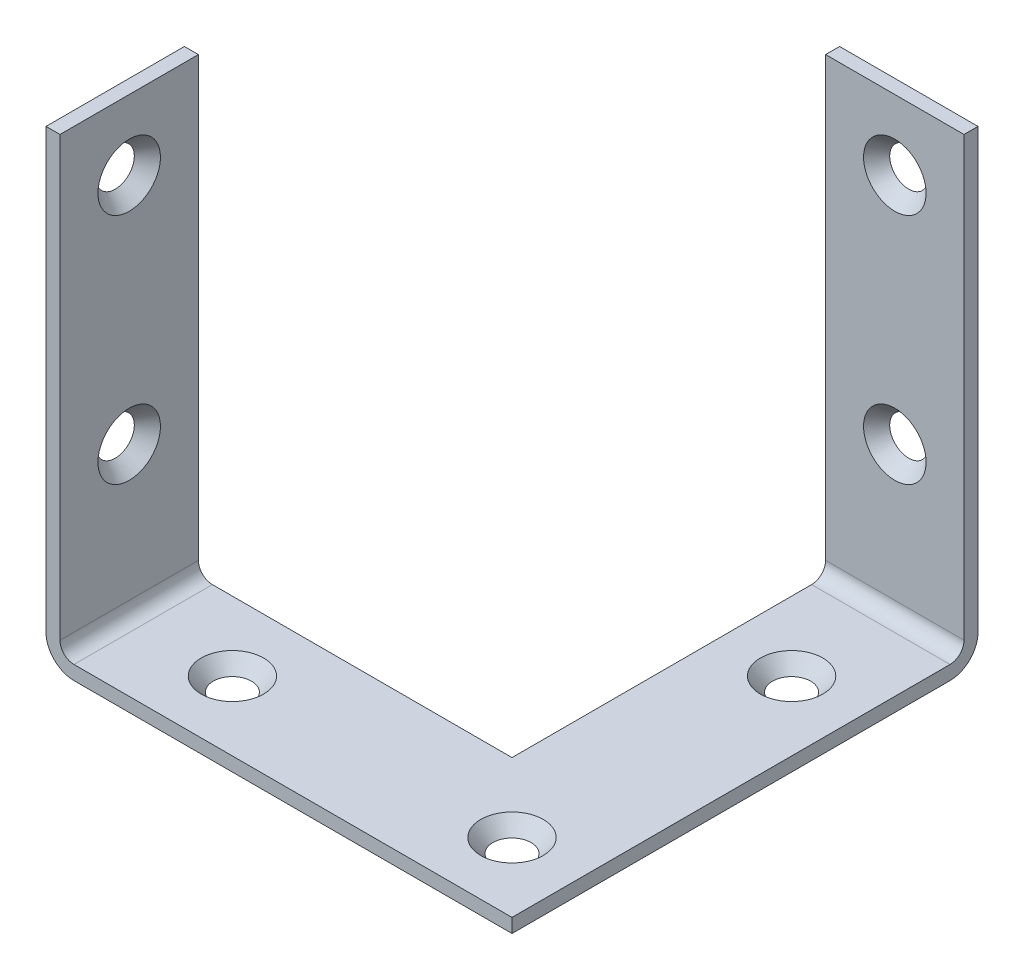
ISO-10303-21;
HEADER;
FILE_DESCRIPTION(('STEP AP214'),'2;1');
FILE_NAME('part.step','',(''),(''),'','','');
FILE_SCHEMA(('AUTOMOTIVE_DESIGN { 1 0 10303 214 1 1 1 1 }'));
ENDSEC;
DATA;
#1=APPLICATION_CONTEXT('core data for automotive mechanical design processes');
#2=APPLICATION_PROTOCOL_DEFINITION('international standard','automotive_design',2000,#1);
#3=PRODUCT_CONTEXT('',#1,'mechanical');
#4=PRODUCT('Part','Part','',(#3));
#5=PRODUCT_RELATED_PRODUCT_CATEGORY('part','',(#4));
#6=PRODUCT_DEFINITION_FORMATION('','',#4);
#7=PRODUCT_DEFINITION_CONTEXT('part definition',#1,'design');
#8=PRODUCT_DEFINITION('design','',#6,#7);
#9=PRODUCT_DEFINITION_SHAPE('','',#8);
#10=(LENGTH_UNIT() NAMED_UNIT(*) SI_UNIT(.MILLI.,.METRE.));
#11=(NAMED_UNIT(*) PLANE_ANGLE_UNIT() SI_UNIT($,.RADIAN.));
#12=(NAMED_UNIT(*) SI_UNIT($,.STERADIAN.) SOLID_ANGLE_UNIT());
#13=UNCERTAINTY_MEASURE_WITH_UNIT(LENGTH_MEASURE(1.E-05),#10,'distance_accuracy_value','');
#14=(GEOMETRIC_REPRESENTATION_CONTEXT(3) GLOBAL_UNCERTAINTY_ASSIGNED_CONTEXT((#13)) GLOBAL_UNIT_ASSIGNED_CONTEXT((#10,
#11,#12)) REPRESENTATION_CONTEXT('',''));
#15=CARTESIAN_POINT('',(0.,0.,0.));
#16=DIRECTION('',(0.,0.,1.));
#17=DIRECTION('',(1.,0.,0.));
#18=AXIS2_PLACEMENT_3D('',#15,#16,#17);
#19=CARTESIAN_POINT('',(-15.0875999999999,3.048,-40.2082));
#20=DIRECTION('',(-1.,0.,0.));
#21=DIRECTION('',(0.,0.,1.));
#22=AXIS2_PLACEMENT_3D('',#19,#20,#21);
#23=PLANE('',#22);
#24=DIRECTION('',(0.,0.,1.));
#25=VECTOR('',#24,1.);
#26=CARTESIAN_POINT('',(-15.0875999999999,0.,-40.2082));
#27=LINE('',#26,#25);
#28=CARTESIAN_POINT('',(-15.0875999999999,0.,-40.2082));
#29=VERTEX_POINT('',#28);
#30=CARTESIAN_POINT('',(-15.0876,0.,-7.5438));
#31=VERTEX_POINT('',#30);
#32=EDGE_CURVE('E130',#29,#31,#27,.T.);
#33=ORIENTED_EDGE('',*,*,#32,.T.);
#34=DIRECTION('',(0.,1.,0.));
#35=VECTOR('',#34,1.);
#36=CARTESIAN_POINT('',(-15.0876,3.048,-7.54380000000001));
#37=LINE('',#36,#35);
#38=CARTESIAN_POINT('',(-15.0876,1.524,-7.5438));
#39=VERTEX_POINT('',#38);
#40=EDGE_CURVE('E11',#31,#39,#37,.T.);
#41=ORIENTED_EDGE('',*,*,#40,.T.);
#42=DIRECTION('',(0.,0.,1.));
#43=VECTOR('',#42,1.);
#44=CARTESIAN_POINT('',(-15.0875999999999,1.524,-40.2082));
#45=LINE('',#44,#43);
#46=CARTESIAN_POINT('',(-15.0875999999999,1.524,-40.2082));
#47=VERTEX_POINT('',#46);
#48=EDGE_CURVE('E133',#47,#39,#45,.T.);
#49=ORIENTED_EDGE('',*,*,#48,.F.);
#50=CARTESIAN_POINT('',(-15.0875999999999,3.048,-40.2082));
#51=DIRECTION('',(-1.,0.,0.));
#52=DIRECTION('',(0.,0.,1.));
#53=AXIS2_PLACEMENT_3D('',#50,#51,#52);
#54=CIRCLE('',#53,1.524);
#55=CARTESIAN_POINT('',(-15.0875999999999,3.048,-41.7322));
#56=VERTEX_POINT('',#55);
#57=EDGE_CURVE('E137',#56,#47,#54,.T.);
#58=ORIENTED_EDGE('',*,*,#57,.F.);
#59=DIRECTION('',(0.,-1.,0.));
#60=VECTOR('',#59,1.);
#61=CARTESIAN_POINT('',(-15.0875999999999,50.8,-41.7322));
#62=LINE('',#61,#60);
#63=CARTESIAN_POINT('',(-15.0875999999999,50.8,-41.7322));
#64=VERTEX_POINT('',#63);
#65=EDGE_CURVE('E139',#64,#56,#62,.T.);
#66=ORIENTED_EDGE('',*,*,#65,.F.);
#67=DIRECTION('',(0.,0.,1.));
#68=VECTOR('',#67,1.);
#69=CARTESIAN_POINT('',(-15.0875999999999,50.8,-43.2562));
#70=LINE('',#69,#68);
#71=CARTESIAN_POINT('',(-15.0875999999999,50.8,-43.2562));
#72=VERTEX_POINT('',#71);
#73=EDGE_CURVE('E141',#72,#64,#70,.T.);
#74=ORIENTED_EDGE('',*,*,#73,.F.);
#75=DIRECTION('',(0.,-1.,0.));
#76=VECTOR('',#75,1.);
#77=CARTESIAN_POINT('',(-15.0875999999999,50.8,-43.2562));
#78=LINE('',#77,#76);
#79=CARTESIAN_POINT('',(-15.0875999999999,3.048,-43.2562));
#80=VERTEX_POINT('',#79);
#81=EDGE_CURVE('E110',#72,#80,#78,.T.);
#82=ORIENTED_EDGE('',*,*,#81,.T.);
#83=CARTESIAN_POINT('',(-15.0875999999999,3.048,-40.2082));
#84=DIRECTION('',(-1.,0.,0.));
#85=DIRECTION('',(0.,0.,-1.));
#86=AXIS2_PLACEMENT_3D('',#83,#84,#85);
#87=CIRCLE('',#86,3.048);
#88=EDGE_CURVE('E144',#80,#29,#87,.T.);
#89=ORIENTED_EDGE('',*,*,#88,.T.);
#90=EDGE_LOOP('',(#33,#41,#49,#58,#66,#74,#82,#89));
#91=FACE_BOUND('',#90,.T.);
#92=ADVANCED_FACE('F38',(#91),#23,.T.);
#93=CARTESIAN_POINT('',(1.26634813746307E-13,0.,-40.2082));
#94=DIRECTION('',(0.,-1.,0.));
#95=DIRECTION('',(1.,0.,0.));
#96=AXIS2_PLACEMENT_3D('',#93,#94,#95);
#97=PLANE('',#96);
#98=DIRECTION('',(1.,0.,0.));
#99=VECTOR('',#98,1.);
#100=CARTESIAN_POINT('',(-47.752,0.,-7.5438));
#101=LINE('',#100,#99);
#102=CARTESIAN_POINT('',(-47.752,0.,-7.5438));
#103=VERTEX_POINT('',#102);
#104=EDGE_CURVE('E508',#103,#31,#101,.T.);
#105=ORIENTED_EDGE('',*,*,#104,.T.);
#106=ORIENTED_EDGE('',*,*,#32,.F.);
#107=DIRECTION('',(-1.,0.,0.));
#108=VECTOR('',#107,1.);
#109=CARTESIAN_POINT('',(1.26634813746307E-13,0.,-40.2082));
#110=LINE('',#109,#108);
#111=CARTESIAN_POINT('',(1.26634813746307E-13,0.,-40.2082));
#112=VERTEX_POINT('',#111);
#113=EDGE_CURVE('E55',#112,#29,#110,.T.);
#114=ORIENTED_EDGE('',*,*,#113,.F.);
#115=DIRECTION('',(0.,0.,1.));
#116=VECTOR('',#115,1.);
#117=CARTESIAN_POINT('',(1.26634813746307E-13,0.,-40.2082));
#118=LINE('',#117,#116);
#119=CARTESIAN_POINT('',(0.,0.,7.54380000000004));
#120=VERTEX_POINT('',#119);
#121=EDGE_CURVE('E88',#112,#120,#118,.T.);
#122=ORIENTED_EDGE('',*,*,#121,.T.);
#123=DIRECTION('',(-1.,0.,0.));
#124=VECTOR('',#123,1.);
#125=CARTESIAN_POINT('',(0.,0.,7.54380000000004));
#126=LINE('',#125,#124);
#127=CARTESIAN_POINT('',(-47.752,0.,7.5438));
#128=VERTEX_POINT('',#127);
#129=EDGE_CURVE('E126',#120,#128,#126,.T.);
#130=ORIENTED_EDGE('',*,*,#129,.T.);
#131=DIRECTION('',(0.,0.,1.));
#132=VECTOR('',#131,1.);
#133=CARTESIAN_POINT('',(-47.752,0.,-7.5438));
#134=LINE('',#133,#132);
#135=EDGE_CURVE('E226',#103,#128,#134,.T.);
#136=ORIENTED_EDGE('',*,*,#135,.F.);
#137=EDGE_LOOP('',(#105,#106,#114,#122,#130,#136));
#138=FACE_BOUND('',#137,.T.);
#139=CARTESIAN_POINT('',(-7.54380000000001,0.,0.));
#140=DIRECTION('',(0.,1.,0.));
#141=DIRECTION('',(-1.,0.,0.));
#142=AXIS2_PLACEMENT_3D('',#139,#140,#141);
#143=CIRCLE('',#142,2.0828);
#144=CARTESIAN_POINT('',(-9.62660000000001,0.,0.));
#145=VERTEX_POINT('',#144);
#146=EDGE_CURVE('E134',#145,#145,#143,.T.);
#147=ORIENTED_EDGE('',*,*,#146,.T.);
#148=EDGE_LOOP('',(#147));
#149=FACE_BOUND('',#148,.T.);
#150=CARTESIAN_POINT('',(-38.0238,0.,0.));
#151=DIRECTION('',(0.,1.,0.));
#152=DIRECTION('',(0.,0.,1.));
#153=AXIS2_PLACEMENT_3D('',#150,#151,#152);
#154=CIRCLE('',#153,2.0828);
#155=CARTESIAN_POINT('',(-38.0238,0.,2.0828));
#156=VERTEX_POINT('',#155);
#157=EDGE_CURVE('E495',#156,#156,#154,.T.);
#158=ORIENTED_EDGE('',*,*,#157,.T.);
#159=EDGE_LOOP('',(#158));
#160=FACE_BOUND('',#159,.T.);
#161=CARTESIAN_POINT('',(-7.54379999999991,0.,-30.48));
#162=DIRECTION('',(0.,1.,0.));
#163=DIRECTION('',(-1.,0.,0.));
#164=AXIS2_PLACEMENT_3D('',#161,#162,#163);
#165=CIRCLE('',#164,2.0828);
#166=CARTESIAN_POINT('',(-9.62659999999991,0.,-30.48));
#167=VERTEX_POINT('',#166);
#168=EDGE_CURVE('E179',#167,#167,#165,.T.);
#169=ORIENTED_EDGE('',*,*,#168,.T.);
#170=EDGE_LOOP('',(#169));
#171=FACE_BOUND('',#170,.T.);
#172=ADVANCED_FACE('F223',(#138,#149,#160,#171),#97,.T.);
#173=CARTESIAN_POINT('',(1.26634813746307E-13,3.048,-40.2082));
#174=DIRECTION('',(-1.,0.,0.));
#175=DIRECTION('',(0.,0.,1.));
#176=AXIS2_PLACEMENT_3D('',#173,#174,#175);
#177=CYLINDRICAL_SURFACE('',#176,3.048);
#178=ORIENTED_EDGE('',*,*,#88,.F.);
#179=DIRECTION('',(-1.,0.,0.));
#180=VECTOR('',#179,1.);
#181=CARTESIAN_POINT('',(1.37043154602168E-13,3.048,-43.2562));
#182=LINE('',#181,#180);
#183=CARTESIAN_POINT('',(1.37043154602168E-13,3.048,-43.2562));
#184=VERTEX_POINT('',#183);
#185=EDGE_CURVE('E79',#184,#80,#182,.T.);
#186=ORIENTED_EDGE('',*,*,#185,.F.);
#187=CARTESIAN_POINT('',(1.26634813746307E-13,3.048,-40.2082));
#188=DIRECTION('',(-1.,0.,0.));
#189=DIRECTION('',(0.,0.,-1.));
#190=AXIS2_PLACEMENT_3D('',#187,#188,#189);
#191=CIRCLE('',#190,3.048);
#192=EDGE_CURVE('E124',#184,#112,#191,.T.);
#193=ORIENTED_EDGE('',*,*,#192,.T.);
#194=ORIENTED_EDGE('',*,*,#113,.T.);
#195=EDGE_LOOP('',(#178,#186,#193,#194));
#196=FACE_BOUND('',#195,.T.);
#197=ADVANCED_FACE('F284',(#196),#177,.T.);
#198=CARTESIAN_POINT('',(1.37043154602168E-13,50.8,-43.2562));
#199=DIRECTION('',(0.,0.,-1.));
#200=DIRECTION('',(0.,-1.,0.));
#201=AXIS2_PLACEMENT_3D('',#198,#199,#200);
#202=PLANE('',#201);
#203=CARTESIAN_POINT('',(-7.54379999999986,17.78,-43.2562));
#204=DIRECTION('',(0.,0.,1.));
#205=DIRECTION('',(0.,1.,0.));
#206=AXIS2_PLACEMENT_3D('',#203,#204,#205);
#207=CIRCLE('',#206,2.0828);
#208=CARTESIAN_POINT('',(-7.54379999999986,19.8628,-43.2562));
#209=VERTEX_POINT('',#208);
#210=EDGE_CURVE('E186',#209,#209,#207,.T.);
#211=ORIENTED_EDGE('',*,*,#210,.T.);
#212=EDGE_LOOP('',(#211));
#213=FACE_BOUND('',#212,.T.);
#214=CARTESIAN_POINT('',(-7.54379999999986,43.18,-43.2562));
#215=DIRECTION('',(0.,0.,1.));
#216=DIRECTION('',(0.,1.,0.));
#217=AXIS2_PLACEMENT_3D('',#214,#215,#216);
#218=CIRCLE('',#217,2.0828);
#219=CARTESIAN_POINT('',(-7.54379999999986,45.2628,-43.2562));
#220=VERTEX_POINT('',#219);
#221=EDGE_CURVE('E181',#220,#220,#218,.T.);
#222=ORIENTED_EDGE('',*,*,#221,.T.);
#223=EDGE_LOOP('',(#222));
#224=FACE_BOUND('',#223,.T.);
#225=ORIENTED_EDGE('',*,*,#81,.F.);
#226=DIRECTION('',(-1.,0.,0.));
#227=VECTOR('',#226,1.);
#228=CARTESIAN_POINT('',(1.37043154602168E-13,50.8,-43.2562));
#229=LINE('',#228,#227);
#230=CARTESIAN_POINT('',(1.37043154602168E-13,50.8,-43.2562));
#231=VERTEX_POINT('',#230);
#232=EDGE_CURVE('E104',#231,#72,#229,.T.);
#233=ORIENTED_EDGE('',*,*,#232,.F.);
#234=DIRECTION('',(0.,-1.,0.));
#235=VECTOR('',#234,1.);
#236=CARTESIAN_POINT('',(1.37043154602168E-13,50.8,-43.2562));
#237=LINE('',#236,#235);
#238=EDGE_CURVE('E108',#231,#184,#237,.T.);
#239=ORIENTED_EDGE('',*,*,#238,.T.);
#240=ORIENTED_EDGE('',*,*,#185,.T.);
#241=EDGE_LOOP('',(#225,#233,#239,#240));
#242=FACE_BOUND('',#241,.T.);
#243=ADVANCED_FACE('F106',(#213,#224,#242),#202,.T.);
#244=CARTESIAN_POINT('',(1.37043154602168E-13,50.8,-43.2562));
#245=DIRECTION('',(0.,-1.,0.));
#246=DIRECTION('',(1.,0.,0.));
#247=AXIS2_PLACEMENT_3D('',#244,#245,#246);
#248=PLANE('',#247);
#249=ORIENTED_EDGE('',*,*,#73,.T.);
#250=DIRECTION('',(-1.,0.,0.));
#251=VECTOR('',#250,1.);
#252=CARTESIAN_POINT('',(1.31838984174237E-13,50.8,-41.7322));
#253=LINE('',#252,#251);
#254=CARTESIAN_POINT('',(1.31838984174237E-13,50.8,-41.7322));
#255=VERTEX_POINT('',#254);
#256=EDGE_CURVE('E113',#255,#64,#253,.T.);
#257=ORIENTED_EDGE('',*,*,#256,.F.);
#258=DIRECTION('',(0.,0.,1.));
#259=VECTOR('',#258,1.);
#260=CARTESIAN_POINT('',(1.37043154602168E-13,50.8,-43.2562));
#261=LINE('',#260,#259);
#262=EDGE_CURVE('E116',#231,#255,#261,.T.);
#263=ORIENTED_EDGE('',*,*,#262,.F.);
#264=ORIENTED_EDGE('',*,*,#232,.T.);
#265=EDGE_LOOP('',(#249,#257,#263,#264));
#266=FACE_BOUND('',#265,.T.);
#267=ADVANCED_FACE('F117',(#266),#248,.F.);
#268=CARTESIAN_POINT('',(1.31838984174237E-13,50.8,-41.7322));
#269=DIRECTION('',(0.,0.,-1.));
#270=DIRECTION('',(0.,-1.,0.));
#271=AXIS2_PLACEMENT_3D('',#268,#269,#270);
#272=PLANE('',#271);
#273=CARTESIAN_POINT('',(-7.54379999999987,43.18,-41.7322));
#274=DIRECTION('',(0.,0.,-1.));
#275=DIRECTION('',(0.,-1.,0.));
#276=AXIS2_PLACEMENT_3D('',#273,#274,#275);
#277=CIRCLE('',#276,3.40759298843195);
#278=CARTESIAN_POINT('',(-7.54379999999987,39.772407011568,-41.7322));
#279=VERTEX_POINT('',#278);
#280=EDGE_CURVE('E163',#279,#279,#277,.T.);
#281=ORIENTED_EDGE('',*,*,#280,.T.);
#282=EDGE_LOOP('',(#281));
#283=FACE_BOUND('',#282,.T.);
#284=CARTESIAN_POINT('',(-7.54379999999987,17.78,-41.7322));
#285=DIRECTION('',(0.,0.,-1.));
#286=DIRECTION('',(0.,-1.,0.));
#287=AXIS2_PLACEMENT_3D('',#284,#285,#286);
#288=CIRCLE('',#287,3.40759298843193);
#289=CARTESIAN_POINT('',(-7.54379999999987,14.3724070115681,-41.7322));
#290=VERTEX_POINT('',#289);
#291=EDGE_CURVE('E148',#290,#290,#288,.T.);
#292=ORIENTED_EDGE('',*,*,#291,.T.);
#293=EDGE_LOOP('',(#292));
#294=FACE_BOUND('',#293,.T.);
#295=ORIENTED_EDGE('',*,*,#65,.T.);
#296=DIRECTION('',(-1.,0.,0.));
#297=VECTOR('',#296,1.);
#298=CARTESIAN_POINT('',(1.31838984174237E-13,3.048,-41.7322));
#299=LINE('',#298,#297);
#300=CARTESIAN_POINT('',(1.31838984174237E-13,3.048,-41.7322));
#301=VERTEX_POINT('',#300);
#302=EDGE_CURVE('E151',#301,#56,#299,.T.);
#303=ORIENTED_EDGE('',*,*,#302,.F.);
#304=DIRECTION('',(0.,-1.,0.));
#305=VECTOR('',#304,1.);
#306=CARTESIAN_POINT('',(1.31838984174237E-13,50.8,-41.7322));
#307=LINE('',#306,#305);
#308=EDGE_CURVE('E121',#255,#301,#307,.T.);
#309=ORIENTED_EDGE('',*,*,#308,.F.);
#310=ORIENTED_EDGE('',*,*,#256,.T.);
#311=EDGE_LOOP('',(#295,#303,#309,#310));
#312=FACE_BOUND('',#311,.T.);
#313=ADVANCED_FACE('F200',(#283,#294,#312),#272,.F.);
#314=CARTESIAN_POINT('',(1.26634813746307E-13,3.048,-40.2082));
#315=DIRECTION('',(-1.,0.,0.));
#316=DIRECTION('',(0.,0.,1.));
#317=AXIS2_PLACEMENT_3D('',#314,#315,#316);
#318=CYLINDRICAL_SURFACE('',#317,1.524);
#319=ORIENTED_EDGE('',*,*,#57,.T.);
#320=DIRECTION('',(-1.,0.,0.));
#321=VECTOR('',#320,1.);
#322=CARTESIAN_POINT('',(1.26634813746307E-13,1.524,-40.2082));
#323=LINE('',#322,#321);
#324=CARTESIAN_POINT('',(1.26634813746307E-13,1.524,-40.2082));
#325=VERTEX_POINT('',#324);
#326=EDGE_CURVE('E154',#325,#47,#323,.T.);
#327=ORIENTED_EDGE('',*,*,#326,.F.);
#328=CARTESIAN_POINT('',(1.26634813746307E-13,3.048,-40.2082));
#329=DIRECTION('',(-1.,0.,0.));
#330=DIRECTION('',(0.,0.,1.));
#331=AXIS2_PLACEMENT_3D('',#328,#329,#330);
#332=CIRCLE('',#331,1.524);
#333=EDGE_CURVE('E195',#301,#325,#332,.T.);
#334=ORIENTED_EDGE('',*,*,#333,.F.);
#335=ORIENTED_EDGE('',*,*,#302,.T.);
#336=EDGE_LOOP('',(#319,#327,#334,#335));
#337=FACE_BOUND('',#336,.T.);
#338=ADVANCED_FACE('F204',(#337),#318,.F.);
#339=CARTESIAN_POINT('',(1.26634813746307E-13,1.524,-40.2082));
#340=DIRECTION('',(0.,-1.,0.));
#341=DIRECTION('',(1.,0.,0.));
#342=AXIS2_PLACEMENT_3D('',#339,#340,#341);
#343=PLANE('',#342);
#344=CARTESIAN_POINT('',(-7.54380000000001,1.524,0.));
#345=DIRECTION('',(0.,-1.,0.));
#346=DIRECTION('',(1.,0.,0.));
#347=AXIS2_PLACEMENT_3D('',#344,#345,#346);
#348=CIRCLE('',#347,3.40759298843193);
#349=CARTESIAN_POINT('',(-4.13620701156809,1.524,0.));
#350=VERTEX_POINT('',#349);
#351=EDGE_CURVE('E166',#350,#350,#348,.T.);
#352=ORIENTED_EDGE('',*,*,#351,.T.);
#353=EDGE_LOOP('',(#352));
#354=FACE_BOUND('',#353,.T.);
#355=DIRECTION('',(-1.,0.,0.));
#356=VECTOR('',#355,1.);
#357=CARTESIAN_POINT('',(0.,1.524,7.54380000000003));
#358=LINE('',#357,#356);
#359=CARTESIAN_POINT('',(0.,1.524,7.54380000000003));
#360=VERTEX_POINT('',#359);
#361=CARTESIAN_POINT('',(-47.752,1.524,7.5438));
#362=VERTEX_POINT('',#361);
#363=EDGE_CURVE('E157',#360,#362,#358,.T.);
#364=ORIENTED_EDGE('',*,*,#363,.F.);
#365=DIRECTION('',(0.,0.,1.));
#366=VECTOR('',#365,1.);
#367=CARTESIAN_POINT('',(1.26634813746307E-13,1.524,-40.2082));
#368=LINE('',#367,#366);
#369=EDGE_CURVE('E193',#325,#360,#368,.T.);
#370=ORIENTED_EDGE('',*,*,#369,.F.);
#371=ORIENTED_EDGE('',*,*,#326,.T.);
#372=ORIENTED_EDGE('',*,*,#48,.T.);
#373=DIRECTION('',(1.,0.,0.));
#374=VECTOR('',#373,1.);
#375=CARTESIAN_POINT('',(-47.752,1.524,-7.5438));
#376=LINE('',#375,#374);
#377=CARTESIAN_POINT('',(-47.752,1.524,-7.5438));
#378=VERTEX_POINT('',#377);
#379=EDGE_CURVE('E510',#378,#39,#376,.T.);
#380=ORIENTED_EDGE('',*,*,#379,.F.);
#381=DIRECTION('',(0.,0.,1.));
#382=VECTOR('',#381,1.);
#383=CARTESIAN_POINT('',(-47.752,1.524,-7.5438));
#384=LINE('',#383,#382);
#385=EDGE_CURVE('E257',#378,#362,#384,.T.);
#386=ORIENTED_EDGE('',*,*,#385,.T.);
#387=EDGE_LOOP('',(#364,#370,#371,#372,#380,#386));
#388=FACE_BOUND('',#387,.T.);
#389=CARTESIAN_POINT('',(-38.0238,1.524,0.));
#390=DIRECTION('',(0.,-1.,0.));
#391=DIRECTION('',(0.,0.,-1.));
#392=AXIS2_PLACEMENT_3D('',#389,#390,#391);
#393=CIRCLE('',#392,3.40759298843193);
#394=CARTESIAN_POINT('',(-38.0238,1.524,3.40759298843193));
#395=VERTEX_POINT('',#394);
#396=EDGE_CURVE('E261',#395,#395,#393,.T.);
#397=ORIENTED_EDGE('',*,*,#396,.T.);
#398=EDGE_LOOP('',(#397));
#399=FACE_BOUND('',#398,.T.);
#400=CARTESIAN_POINT('',(-7.54379999999991,1.524,-30.48));
#401=DIRECTION('',(0.,-1.,0.));
#402=DIRECTION('',(1.,0.,0.));
#403=AXIS2_PLACEMENT_3D('',#400,#401,#402);
#404=CIRCLE('',#403,3.40759298843193);
#405=CARTESIAN_POINT('',(-10.9513929884318,1.524,-30.48));
#406=VERTEX_POINT('',#405);
#407=EDGE_CURVE('E47',#406,#406,#404,.T.);
#408=ORIENTED_EDGE('',*,*,#407,.T.);
#409=EDGE_LOOP('',(#408));
#410=FACE_BOUND('',#409,.T.);
#411=ADVANCED_FACE('F171',(#354,#388,#399,#410),#343,.F.);
#412=CARTESIAN_POINT('',(0.,1.524,7.54380000000003));
#413=DIRECTION('',(0.,0.,-1.));
#414=DIRECTION('',(0.,-1.,0.));
#415=AXIS2_PLACEMENT_3D('',#412,#413,#414);
#416=PLANE('',#415);
#417=ORIENTED_EDGE('',*,*,#363,.T.);
#418=CARTESIAN_POINT('',(-47.752,3.048,7.5438));
#419=DIRECTION('',(0.,0.,1.));
#420=DIRECTION('',(1.,0.,0.));
#421=AXIS2_PLACEMENT_3D('',#418,#419,#420);
#422=CIRCLE('',#421,1.524);
#423=CARTESIAN_POINT('',(-49.276,3.048,7.5438));
#424=VERTEX_POINT('',#423);
#425=EDGE_CURVE('E497',#424,#362,#422,.T.);
#426=ORIENTED_EDGE('',*,*,#425,.F.);
#427=DIRECTION('',(0.,-1.,0.));
#428=VECTOR('',#427,1.);
#429=CARTESIAN_POINT('',(-49.276,50.8,7.5438));
#430=LINE('',#429,#428);
#431=CARTESIAN_POINT('',(-49.276,50.8,7.5438));
#432=VERTEX_POINT('',#431);
#433=EDGE_CURVE('E501',#432,#424,#430,.T.);
#434=ORIENTED_EDGE('',*,*,#433,.F.);
#435=DIRECTION('',(1.,0.,0.));
#436=VECTOR('',#435,1.);
#437=CARTESIAN_POINT('',(-50.8,50.8,7.5438));
#438=LINE('',#437,#436);
#439=CARTESIAN_POINT('',(-50.8,50.8,7.5438));
#440=VERTEX_POINT('',#439);
#441=EDGE_CURVE('E528',#440,#432,#438,.T.);
#442=ORIENTED_EDGE('',*,*,#441,.F.);
#443=DIRECTION('',(0.,-1.,0.));
#444=VECTOR('',#443,1.);
#445=CARTESIAN_POINT('',(-50.8,50.8,7.5438));
#446=LINE('',#445,#444);
#447=CARTESIAN_POINT('',(-50.8,3.048,7.5438));
#448=VERTEX_POINT('',#447);
#449=EDGE_CURVE('E530',#440,#448,#446,.T.);
#450=ORIENTED_EDGE('',*,*,#449,.T.);
#451=CARTESIAN_POINT('',(-47.752,3.048,7.5438));
#452=DIRECTION('',(0.,0.,1.));
#453=DIRECTION('',(-1.,0.,0.));
#454=AXIS2_PLACEMENT_3D('',#451,#452,#453);
#455=CIRCLE('',#454,3.048);
#456=EDGE_CURVE('E219',#448,#128,#455,.T.);
#457=ORIENTED_EDGE('',*,*,#456,.T.);
#458=ORIENTED_EDGE('',*,*,#129,.F.);
#459=DIRECTION('',(0.,-1.,0.));
#460=VECTOR('',#459,1.);
#461=CARTESIAN_POINT('',(0.,1.524,7.54380000000003));
#462=LINE('',#461,#460);
#463=EDGE_CURVE('E191',#360,#120,#462,.T.);
#464=ORIENTED_EDGE('',*,*,#463,.F.);
#465=EDGE_LOOP('',(#417,#426,#434,#442,#450,#457,#458,#464));
#466=FACE_BOUND('',#465,.T.);
#467=ADVANCED_FACE('F215',(#466),#416,.F.);
#468=CARTESIAN_POINT('',(1.26634813746307E-13,3.048,-40.2082));
#469=DIRECTION('',(-1.,0.,0.));
#470=DIRECTION('',(0.,0.,1.));
#471=AXIS2_PLACEMENT_3D('',#468,#469,#470);
#472=PLANE('',#471);
#473=ORIENTED_EDGE('',*,*,#463,.T.);
#474=ORIENTED_EDGE('',*,*,#121,.F.);
#475=ORIENTED_EDGE('',*,*,#192,.F.);
#476=ORIENTED_EDGE('',*,*,#238,.F.);
#477=ORIENTED_EDGE('',*,*,#262,.T.);
#478=ORIENTED_EDGE('',*,*,#308,.T.);
#479=ORIENTED_EDGE('',*,*,#333,.T.);
#480=ORIENTED_EDGE('',*,*,#369,.T.);
#481=EDGE_LOOP('',(#473,#474,#475,#476,#477,#478,#479,#480));
#482=FACE_BOUND('',#481,.T.);
#483=ADVANCED_FACE('F123',(#482),#472,.F.);
#484=CARTESIAN_POINT('',(-7.54379999999986,43.18,-43.2562));
#485=DIRECTION('',(0.,0.,1.));
#486=DIRECTION('',(1.,0.,0.));
#487=AXIS2_PLACEMENT_3D('',#484,#485,#486);
#488=CONICAL_SURFACE('',#487,2.0828,0.715584993317671);
#489=ORIENTED_EDGE('',*,*,#280,.F.);
#490=EDGE_LOOP('',(#489));
#491=FACE_BOUND('',#490,.T.);
#492=ORIENTED_EDGE('',*,*,#221,.F.);
#493=EDGE_LOOP('',(#492));
#494=FACE_BOUND('',#493,.T.);
#495=ADVANCED_FACE('F269',(#491,#494),#488,.F.);
#496=CARTESIAN_POINT('',(-7.54379999999986,17.78,-43.2562));
#497=DIRECTION('',(0.,0.,1.));
#498=DIRECTION('',(1.,0.,0.));
#499=AXIS2_PLACEMENT_3D('',#496,#497,#498);
#500=CONICAL_SURFACE('',#499,2.0828,0.715584993317677);
#501=ORIENTED_EDGE('',*,*,#291,.F.);
#502=EDGE_LOOP('',(#501));
#503=FACE_BOUND('',#502,.T.);
#504=ORIENTED_EDGE('',*,*,#210,.F.);
#505=EDGE_LOOP('',(#504));
#506=FACE_BOUND('',#505,.T.);
#507=ADVANCED_FACE('F176',(#503,#506),#500,.F.);
#508=CARTESIAN_POINT('',(-7.54379999999991,0.,-30.48));
#509=DIRECTION('',(0.,1.,0.));
#510=DIRECTION('',(-1.,0.,0.));
#511=AXIS2_PLACEMENT_3D('',#508,#509,#510);
#512=CONICAL_SURFACE('',#511,2.0828,0.715584993317672);
#513=CARTESIAN_POINT('',(-10.9513929884318,1.524,-30.48));
#514=CARTESIAN_POINT('',(-10.937593061469,1.508125,-30.48));
#515=CARTESIAN_POINT('',(-10.9237931345062,1.49225,-30.48));
#516=CARTESIAN_POINT('',(-10.8961932805805,1.4605,-30.48));
#517=CARTESIAN_POINT('',(-10.8823933536177,1.444625,-30.48));
#518=CARTESIAN_POINT('',(-10.854793499692,1.412875,-30.48));
#519=CARTESIAN_POINT('',(-10.8409935727292,1.397,-30.48));
#520=CARTESIAN_POINT('',(-10.8133937188035,1.36525,-30.48));
#521=CARTESIAN_POINT('',(-10.7995937918407,1.349375,-30.48));
#522=CARTESIAN_POINT('',(-10.771993937915,1.317625,-30.48));
#523=CARTESIAN_POINT('',(-10.7581940109522,1.30175,-30.48));
#524=CARTESIAN_POINT('',(-10.7305941570265,1.27,-30.48));
#525=CARTESIAN_POINT('',(-10.7167942300637,1.254125,-30.48));
#526=CARTESIAN_POINT('',(-10.689194376138,1.222375,-30.48));
#527=CARTESIAN_POINT('',(-10.6753944491752,1.2065,-30.48));
#528=CARTESIAN_POINT('',(-10.6477945952495,1.17475,-30.48));
#529=CARTESIAN_POINT('',(-10.6339946682867,1.158875,-30.48));
#530=CARTESIAN_POINT('',(-10.606394814361,1.127125,-30.48));
#531=CARTESIAN_POINT('',(-10.5925948873982,1.11125,-30.48));
#532=CARTESIAN_POINT('',(-10.5649950334725,1.0795,-30.48));
#533=CARTESIAN_POINT('',(-10.5511951065097,1.063625,-30.48));
#534=CARTESIAN_POINT('',(-10.523595252584,1.031875,-30.48));
#535=CARTESIAN_POINT('',(-10.5097953256212,1.016,-30.48));
#536=CARTESIAN_POINT('',(-10.4821954716955,0.984249999999998,-30.48));
#537=CARTESIAN_POINT('',(-10.4683955447327,0.968374999999998,-30.48));
#538=CARTESIAN_POINT('',(-10.440795690807,0.936624999999998,-30.48));
#539=CARTESIAN_POINT('',(-10.4269957638442,0.920749999999998,-30.48));
#540=CARTESIAN_POINT('',(-10.3993959099185,0.888999999999998,-30.48));
#541=CARTESIAN_POINT('',(-10.3855959829557,0.873124999999998,-30.48));
#542=CARTESIAN_POINT('',(-10.35799612903,0.841374999999998,-30.48));
#543=CARTESIAN_POINT('',(-10.3441962020672,0.825499999999998,-30.48));
#544=CARTESIAN_POINT('',(-10.3165963481415,0.793749999999998,-30.48));
#545=CARTESIAN_POINT('',(-10.3027964211787,0.777874999999998,-30.48));
#546=CARTESIAN_POINT('',(-10.275196567253,0.746124999999998,-30.48));
#547=CARTESIAN_POINT('',(-10.2613966402902,0.730249999999998,-30.48));
#548=CARTESIAN_POINT('',(-10.2337967863645,0.698499999999997,-30.48));
#549=CARTESIAN_POINT('',(-10.2199968594017,0.682624999999997,-30.48));
#550=CARTESIAN_POINT('',(-10.192397005476,0.650874999999997,-30.48));
#551=CARTESIAN_POINT('',(-10.1785970785132,0.634999999999997,-30.48));
#552=CARTESIAN_POINT('',(-10.1509972245875,0.603249999999997,-30.48));
#553=CARTESIAN_POINT('',(-10.1371972976247,0.587374999999997,-30.48));
#554=CARTESIAN_POINT('',(-10.109597443699,0.555624999999997,-30.48));
#555=CARTESIAN_POINT('',(-10.0957975167362,0.539749999999997,-30.48));
#556=CARTESIAN_POINT('',(-10.0681976628106,0.507999999999997,-30.48));
#557=CARTESIAN_POINT('',(-10.0543977358477,0.492124999999997,-30.48));
#558=CARTESIAN_POINT('',(-10.0267978819221,0.460374999999997,-30.48));
#559=CARTESIAN_POINT('',(-10.0129979549592,0.444499999999997,-30.48));
#560=CARTESIAN_POINT('',(-9.98539810103355,0.412749999999997,-30.48));
#561=CARTESIAN_POINT('',(-9.97159817407072,0.396874999999996,-30.48));
#562=CARTESIAN_POINT('',(-9.94399832014506,0.365124999999996,-30.48));
#563=CARTESIAN_POINT('',(-9.93019839318223,0.349249999999996,-30.48));
#564=CARTESIAN_POINT('',(-9.90259853925656,0.317499999999996,-30.48));
#565=CARTESIAN_POINT('',(-9.88879861229373,0.301624999999996,-30.48));
#566=CARTESIAN_POINT('',(-9.86119875836806,0.269874999999996,-30.48));
#567=CARTESIAN_POINT('',(-9.84739883140523,0.253999999999996,-30.48));
#568=CARTESIAN_POINT('',(-9.81979897747957,0.222249999999996,-30.48));
#569=CARTESIAN_POINT('',(-9.80599905051673,0.206374999999996,-30.48));
#570=CARTESIAN_POINT('',(-9.77839919659107,0.174624999999996,-30.48));
#571=CARTESIAN_POINT('',(-9.76459926962823,0.158749999999996,-30.48));
#572=CARTESIAN_POINT('',(-9.73699941570257,0.126999999999995,-30.48));
#573=CARTESIAN_POINT('',(-9.72319948873974,0.111124999999996,-30.48));
#574=CARTESIAN_POINT('',(-9.69559963481407,0.0793749999999957,-30.48));
#575=CARTESIAN_POINT('',(-9.68179970785124,0.0634999999999955,-30.48));
#576=CARTESIAN_POINT('',(-9.65419985392557,0.0317499999999952,-30.48));
#577=CARTESIAN_POINT('',(-9.64039992696274,0.0158749999999951,-30.48));
#578=CARTESIAN_POINT('',(-9.62659999999991,0.,-30.48));
#579=B_SPLINE_CURVE_WITH_KNOTS('',3,(#513,#514,#515,#516,#517,#518,#519,#520,#521,#522,#523,
#524,#525,#526,#527,#528,#529,#530,#531,#532,#533,#534,#535,#536,#537,#538,#539,#540,#541,#542,
#543,#544,#545,#546,#547,#548,#549,#550,#551,#552,#553,#554,#555,#556,#557,#558,#559,#560,#561,
#562,#563,#564,#565,#566,#567,#568,#569,#570,#571,#572,#573,#574,#575,#576,#577,#578),
.UNSPECIFIED.,.F.,.F.,(4,2,2,2,2,2,2,2,2,2,2,2,2,2,2,2,2,2,2,2,2,2,2,2,2,2,2,2,2,2,2,2,4),(0.,
0.063103743808238,0.126207487616475,0.189311231424712,0.252414975232949,0.315518719041185,
0.378622462849423,0.44172620665766,0.504829950465898,0.567933694274135,0.631037438082372,
0.694141181890609,0.757244925698846,0.820348669507084,0.883452413315321,0.946556157123558,
1.0096599009318,1.07276364474003,1.13586738854827,1.19897113235651,1.26207487616474,
1.32517861997298,1.38828236378122,1.45138610758946,1.51448985139769,1.57759359520593,
1.64069733901417,1.7038010828224,1.76690482663064,1.83000857043888,1.89311231424712,
1.95621605805535,2.01931980186359),.UNSPECIFIED.);
#580=EDGE_CURVE('BSEAM173',#406,#167,#579,.T.);
#581=ORIENTED_EDGE('',*,*,#407,.F.);
#582=ORIENTED_EDGE('',*,*,#168,.F.);
#583=ORIENTED_EDGE('',*,*,#580,.T.);
#584=ORIENTED_EDGE('',*,*,#580,.F.);
#585=EDGE_LOOP('',(#581,#583,#582,#584));
#586=FACE_BOUND('',#585,.T.);
#587=ADVANCED_FACE('F173',(#586),#512,.F.);
#588=CARTESIAN_POINT('',(-7.54380000000001,0.,0.));
#589=DIRECTION('',(0.,1.,0.));
#590=DIRECTION('',(-1.,0.,0.));
#591=AXIS2_PLACEMENT_3D('',#588,#589,#590);
#592=CONICAL_SURFACE('',#591,2.0828,0.715584993317672);
#593=ORIENTED_EDGE('',*,*,#351,.F.);
#594=EDGE_LOOP('',(#593));
#595=FACE_BOUND('',#594,.T.);
#596=ORIENTED_EDGE('',*,*,#146,.F.);
#597=EDGE_LOOP('',(#596));
#598=FACE_BOUND('',#597,.T.);
#599=ADVANCED_FACE('F40',(#595,#598),#592,.F.);
#600=CARTESIAN_POINT('',(-47.752,3.048,-7.5438));
#601=DIRECTION('',(0.,0.,1.));
#602=DIRECTION('',(1.,0.,0.));
#603=AXIS2_PLACEMENT_3D('',#600,#601,#602);
#604=CYLINDRICAL_SURFACE('',#603,3.048);
#605=ORIENTED_EDGE('',*,*,#456,.F.);
#606=DIRECTION('',(0.,0.,1.));
#607=VECTOR('',#606,1.);
#608=CARTESIAN_POINT('',(-50.8,3.048,-7.5438));
#609=LINE('',#608,#607);
#610=CARTESIAN_POINT('',(-50.8,3.048,-7.5438));
#611=VERTEX_POINT('',#610);
#612=EDGE_CURVE('E238',#611,#448,#609,.T.);
#613=ORIENTED_EDGE('',*,*,#612,.F.);
#614=CARTESIAN_POINT('',(-47.752,3.048,-7.5438));
#615=DIRECTION('',(0.,0.,1.));
#616=DIRECTION('',(-1.,0.,0.));
#617=AXIS2_PLACEMENT_3D('',#614,#615,#616);
#618=CIRCLE('',#617,3.048);
#619=EDGE_CURVE('E236',#611,#103,#618,.T.);
#620=ORIENTED_EDGE('',*,*,#619,.T.);
#621=ORIENTED_EDGE('',*,*,#135,.T.);
#622=EDGE_LOOP('',(#605,#613,#620,#621));
#623=FACE_BOUND('',#622,.T.);
#624=ADVANCED_FACE('F233',(#623),#604,.T.);
#625=CARTESIAN_POINT('',(-50.8,50.8,-7.5438));
#626=DIRECTION('',(-1.,0.,0.));
#627=DIRECTION('',(0.,-1.,0.));
#628=AXIS2_PLACEMENT_3D('',#625,#626,#627);
#629=PLANE('',#628);
#630=CARTESIAN_POINT('',(-50.8,17.78,0.));
#631=DIRECTION('',(1.,0.,0.));
#632=DIRECTION('',(0.,1.,0.));
#633=AXIS2_PLACEMENT_3D('',#630,#631,#632);
#634=CIRCLE('',#633,2.0828);
#635=CARTESIAN_POINT('',(-50.8,19.8628,0.));
#636=VERTEX_POINT('',#635);
#637=EDGE_CURVE('E504',#636,#636,#634,.T.);
#638=ORIENTED_EDGE('',*,*,#637,.T.);
#639=EDGE_LOOP('',(#638));
#640=FACE_BOUND('',#639,.T.);
#641=CARTESIAN_POINT('',(-50.8,43.18,0.));
#642=DIRECTION('',(1.,0.,0.));
#643=DIRECTION('',(0.,1.,0.));
#644=AXIS2_PLACEMENT_3D('',#641,#642,#643);
#645=CIRCLE('',#644,2.0828);
#646=CARTESIAN_POINT('',(-50.8,45.2628,0.));
#647=VERTEX_POINT('',#646);
#648=EDGE_CURVE('E498',#647,#647,#645,.T.);
#649=ORIENTED_EDGE('',*,*,#648,.T.);
#650=EDGE_LOOP('',(#649));
#651=FACE_BOUND('',#650,.T.);
#652=ORIENTED_EDGE('',*,*,#449,.F.);
#653=DIRECTION('',(0.,0.,1.));
#654=VECTOR('',#653,1.);
#655=CARTESIAN_POINT('',(-50.8,50.8,-7.5438));
#656=LINE('',#655,#654);
#657=CARTESIAN_POINT('',(-50.8,50.8,-7.5438));
#658=VERTEX_POINT('',#657);
#659=EDGE_CURVE('E244',#658,#440,#656,.T.);
#660=ORIENTED_EDGE('',*,*,#659,.F.);
#661=DIRECTION('',(0.,-1.,0.));
#662=VECTOR('',#661,1.);
#663=CARTESIAN_POINT('',(-50.8,50.8,-7.5438));
#664=LINE('',#663,#662);
#665=EDGE_CURVE('E522',#658,#611,#664,.T.);
#666=ORIENTED_EDGE('',*,*,#665,.T.);
#667=ORIENTED_EDGE('',*,*,#612,.T.);
#668=EDGE_LOOP('',(#652,#660,#666,#667));
#669=FACE_BOUND('',#668,.T.);
#670=ADVANCED_FACE('F399',(#640,#651,#669),#629,.T.);
#671=CARTESIAN_POINT('',(-50.8,50.8,-7.5438));
#672=DIRECTION('',(0.,-1.,0.));
#673=DIRECTION('',(0.,0.,-1.));
#674=AXIS2_PLACEMENT_3D('',#671,#672,#673);
#675=PLANE('',#674);
#676=ORIENTED_EDGE('',*,*,#441,.T.);
#677=DIRECTION('',(0.,0.,1.));
#678=VECTOR('',#677,1.);
#679=CARTESIAN_POINT('',(-49.276,50.8,-7.5438));
#680=LINE('',#679,#678);
#681=CARTESIAN_POINT('',(-49.276,50.8,-7.5438));
#682=VERTEX_POINT('',#681);
#683=EDGE_CURVE('E251',#682,#432,#680,.T.);
#684=ORIENTED_EDGE('',*,*,#683,.F.);
#685=DIRECTION('',(1.,0.,0.));
#686=VECTOR('',#685,1.);
#687=CARTESIAN_POINT('',(-50.8,50.8,-7.5438));
#688=LINE('',#687,#686);
#689=EDGE_CURVE('E519',#658,#682,#688,.T.);
#690=ORIENTED_EDGE('',*,*,#689,.F.);
#691=ORIENTED_EDGE('',*,*,#659,.T.);
#692=EDGE_LOOP('',(#676,#684,#690,#691));
#693=FACE_BOUND('',#692,.T.);
#694=ADVANCED_FACE('F407',(#693),#675,.F.);
#695=CARTESIAN_POINT('',(-49.276,50.8,-7.5438));
#696=DIRECTION('',(-1.,0.,0.));
#697=DIRECTION('',(0.,-1.,0.));
#698=AXIS2_PLACEMENT_3D('',#695,#696,#697);
#699=PLANE('',#698);
#700=CARTESIAN_POINT('',(-49.276,43.18,0.));
#701=DIRECTION('',(-1.,0.,0.));
#702=DIRECTION('',(0.,-1.,0.));
#703=AXIS2_PLACEMENT_3D('',#700,#701,#702);
#704=CIRCLE('',#703,3.40759298843195);
#705=CARTESIAN_POINT('',(-49.276,39.772407011568,0.));
#706=VERTEX_POINT('',#705);
#707=EDGE_CURVE('E241',#706,#706,#704,.T.);
#708=ORIENTED_EDGE('',*,*,#707,.T.);
#709=EDGE_LOOP('',(#708));
#710=FACE_BOUND('',#709,.T.);
#711=CARTESIAN_POINT('',(-49.276,17.78,0.));
#712=DIRECTION('',(-1.,0.,0.));
#713=DIRECTION('',(0.,-1.,0.));
#714=AXIS2_PLACEMENT_3D('',#711,#712,#713);
#715=CIRCLE('',#714,3.40759298843193);
#716=CARTESIAN_POINT('',(-49.276,14.3724070115681,0.));
#717=VERTEX_POINT('',#716);
#718=EDGE_CURVE('E237',#717,#717,#715,.T.);
#719=ORIENTED_EDGE('',*,*,#718,.T.);
#720=EDGE_LOOP('',(#719));
#721=FACE_BOUND('',#720,.T.);
#722=ORIENTED_EDGE('',*,*,#433,.T.);
#723=DIRECTION('',(0.,0.,1.));
#724=VECTOR('',#723,1.);
#725=CARTESIAN_POINT('',(-49.276,3.048,-7.5438));
#726=LINE('',#725,#724);
#727=CARTESIAN_POINT('',(-49.276,3.048,-7.5438));
#728=VERTEX_POINT('',#727);
#729=EDGE_CURVE('E254',#728,#424,#726,.T.);
#730=ORIENTED_EDGE('',*,*,#729,.F.);
#731=DIRECTION('',(0.,-1.,0.));
#732=VECTOR('',#731,1.);
#733=CARTESIAN_POINT('',(-49.276,50.8,-7.5438));
#734=LINE('',#733,#732);
#735=EDGE_CURVE('E516',#682,#728,#734,.T.);
#736=ORIENTED_EDGE('',*,*,#735,.F.);
#737=ORIENTED_EDGE('',*,*,#683,.T.);
#738=EDGE_LOOP('',(#722,#730,#736,#737));
#739=FACE_BOUND('',#738,.T.);
#740=ADVANCED_FACE('F417',(#710,#721,#739),#699,.F.);
#741=CARTESIAN_POINT('',(-47.752,3.048,-7.5438));
#742=DIRECTION('',(0.,0.,1.));
#743=DIRECTION('',(1.,0.,0.));
#744=AXIS2_PLACEMENT_3D('',#741,#742,#743);
#745=CYLINDRICAL_SURFACE('',#744,1.524);
#746=ORIENTED_EDGE('',*,*,#425,.T.);
#747=ORIENTED_EDGE('',*,*,#385,.F.);
#748=CARTESIAN_POINT('',(-47.752,3.048,-7.5438));
#749=DIRECTION('',(0.,0.,1.));
#750=DIRECTION('',(1.,0.,0.));
#751=AXIS2_PLACEMENT_3D('',#748,#749,#750);
#752=CIRCLE('',#751,1.524);
#753=EDGE_CURVE('E513',#728,#378,#752,.T.);
#754=ORIENTED_EDGE('',*,*,#753,.F.);
#755=ORIENTED_EDGE('',*,*,#729,.T.);
#756=EDGE_LOOP('',(#746,#747,#754,#755));
#757=FACE_BOUND('',#756,.T.);
#758=ADVANCED_FACE('F427',(#757),#745,.F.);
#759=CARTESIAN_POINT('',(-47.752,3.048,-7.5438));
#760=DIRECTION('',(0.,0.,1.));
#761=DIRECTION('',(1.,0.,0.));
#762=AXIS2_PLACEMENT_3D('',#759,#760,#761);
#763=PLANE('',#762);
#764=ORIENTED_EDGE('',*,*,#40,.F.);
#765=ORIENTED_EDGE('',*,*,#104,.F.);
#766=ORIENTED_EDGE('',*,*,#619,.F.);
#767=ORIENTED_EDGE('',*,*,#665,.F.);
#768=ORIENTED_EDGE('',*,*,#689,.T.);
#769=ORIENTED_EDGE('',*,*,#735,.T.);
#770=ORIENTED_EDGE('',*,*,#753,.T.);
#771=ORIENTED_EDGE('',*,*,#379,.T.);
#772=EDGE_LOOP('',(#764,#765,#766,#767,#768,#769,#770,#771));
#773=FACE_BOUND('',#772,.T.);
#774=ADVANCED_FACE('F437',(#773),#763,.F.);
#775=CARTESIAN_POINT('',(-50.8,43.18,0.));
#776=DIRECTION('',(1.,0.,0.));
#777=DIRECTION('',(0.,0.,-1.));
#778=AXIS2_PLACEMENT_3D('',#775,#776,#777);
#779=CONICAL_SURFACE('',#778,2.0828,0.715584993317671);
#780=ORIENTED_EDGE('',*,*,#707,.F.);
#781=EDGE_LOOP('',(#780));
#782=FACE_BOUND('',#781,.T.);
#783=ORIENTED_EDGE('',*,*,#648,.F.);
#784=EDGE_LOOP('',(#783));
#785=FACE_BOUND('',#784,.T.);
#786=ADVANCED_FACE('F447',(#782,#785),#779,.F.);
#787=CARTESIAN_POINT('',(-50.8,17.78,0.));
#788=DIRECTION('',(1.,0.,0.));
#789=DIRECTION('',(0.,0.,-1.));
#790=AXIS2_PLACEMENT_3D('',#787,#788,#789);
#791=CONICAL_SURFACE('',#790,2.0828,0.715584993317677);
#792=ORIENTED_EDGE('',*,*,#718,.F.);
#793=EDGE_LOOP('',(#792));
#794=FACE_BOUND('',#793,.T.);
#795=ORIENTED_EDGE('',*,*,#637,.F.);
#796=EDGE_LOOP('',(#795));
#797=FACE_BOUND('',#796,.T.);
#798=ADVANCED_FACE('F457',(#794,#797),#791,.F.);
#799=CARTESIAN_POINT('',(-38.0238,0.,0.));
#800=DIRECTION('',(0.,1.,0.));
#801=DIRECTION('',(0.,0.,1.));
#802=AXIS2_PLACEMENT_3D('',#799,#800,#801);
#803=CONICAL_SURFACE('',#802,2.0828,0.715584993317672);
#804=CARTESIAN_POINT('',(-38.0238,1.524,3.40759298843193));
#805=CARTESIAN_POINT('',(-38.0238,1.508125,3.3937930614691));
#806=CARTESIAN_POINT('',(-38.0238,1.49225,3.37999313450626));
#807=CARTESIAN_POINT('',(-38.0238,1.4605,3.3523932805806));
#808=CARTESIAN_POINT('',(-38.0238,1.444625,3.33859335361777));
#809=CARTESIAN_POINT('',(-38.0238,1.412875,3.3109934996921));
#810=CARTESIAN_POINT('',(-38.0238,1.397,3.29719357272927));
#811=CARTESIAN_POINT('',(-38.0238,1.36525,3.2695937188036));
#812=CARTESIAN_POINT('',(-38.0238,1.349375,3.25579379184077));
#813=CARTESIAN_POINT('',(-38.0238,1.317625,3.2281939379151));
#814=CARTESIAN_POINT('',(-38.0238,1.30175,3.21439401095227));
#815=CARTESIAN_POINT('',(-38.0238,1.27,3.18679415702661));
#816=CARTESIAN_POINT('',(-38.0238,1.254125,3.17299423006377));
#817=CARTESIAN_POINT('',(-38.0238,1.222375,3.14539437613811));
#818=CARTESIAN_POINT('',(-38.0238,1.2065,3.13159444917528));
#819=CARTESIAN_POINT('',(-38.0238,1.17475,3.10399459524961));
#820=CARTESIAN_POINT('',(-38.0238,1.158875,3.09019466828678));
#821=CARTESIAN_POINT('',(-38.0238,1.127125,3.06259481436111));
#822=CARTESIAN_POINT('',(-38.0238,1.11125,3.04879488739828));
#823=CARTESIAN_POINT('',(-38.0238,1.0795,3.02119503347262));
#824=CARTESIAN_POINT('',(-38.0238,1.063625,3.00739510650978));
#825=CARTESIAN_POINT('',(-38.0238,1.031875,2.97979525258412));
#826=CARTESIAN_POINT('',(-38.0238,1.016,2.96599532562129));
#827=CARTESIAN_POINT('',(-38.0238,0.984249999999998,2.93839547169562));
#828=CARTESIAN_POINT('',(-38.0238,0.968374999999998,2.92459554473279));
#829=CARTESIAN_POINT('',(-38.0238,0.936624999999998,2.89699569080712));
#830=CARTESIAN_POINT('',(-38.0238,0.920749999999998,2.88319576384429));
#831=CARTESIAN_POINT('',(-38.0238,0.888999999999998,2.85559590991863));
#832=CARTESIAN_POINT('',(-38.0238,0.873124999999998,2.84179598295579));
#833=CARTESIAN_POINT('',(-38.0238,0.841374999999998,2.81419612903013));
#834=CARTESIAN_POINT('',(-38.0238,0.825499999999998,2.8003962020673));
#835=CARTESIAN_POINT('',(-38.0238,0.793749999999998,2.77279634814163));
#836=CARTESIAN_POINT('',(-38.0238,0.777874999999998,2.7589964211788));
#837=CARTESIAN_POINT('',(-38.0238,0.746124999999998,2.73139656725313));
#838=CARTESIAN_POINT('',(-38.0238,0.730249999999998,2.7175966402903));
#839=CARTESIAN_POINT('',(-38.0238,0.698499999999997,2.68999678636464));
#840=CARTESIAN_POINT('',(-38.0238,0.682624999999997,2.6761968594018));
#841=CARTESIAN_POINT('',(-38.0238,0.650874999999997,2.64859700547614));
#842=CARTESIAN_POINT('',(-38.0238,0.634999999999997,2.6347970785133));
#843=CARTESIAN_POINT('',(-38.0238,0.603249999999997,2.60719722458764));
#844=CARTESIAN_POINT('',(-38.0238,0.587374999999997,2.59339729762481));
#845=CARTESIAN_POINT('',(-38.0238,0.555624999999997,2.56579744369914));
#846=CARTESIAN_POINT('',(-38.0238,0.539749999999997,2.55199751673631));
#847=CARTESIAN_POINT('',(-38.0238,0.507999999999997,2.52439766281064));
#848=CARTESIAN_POINT('',(-38.0238,0.492124999999997,2.51059773584781));
#849=CARTESIAN_POINT('',(-38.0238,0.460374999999997,2.48299788192215));
#850=CARTESIAN_POINT('',(-38.0238,0.444499999999997,2.46919795495931));
#851=CARTESIAN_POINT('',(-38.0238,0.412749999999997,2.44159810103365));
#852=CARTESIAN_POINT('',(-38.0238,0.396874999999996,2.42779817407082));
#853=CARTESIAN_POINT('',(-38.0238,0.365124999999996,2.40019832014515));
#854=CARTESIAN_POINT('',(-38.0238,0.349249999999996,2.38639839318232));
#855=CARTESIAN_POINT('',(-38.0238,0.317499999999996,2.35879853925665));
#856=CARTESIAN_POINT('',(-38.0238,0.301624999999996,2.34499861229382));
#857=CARTESIAN_POINT('',(-38.0238,0.269874999999996,2.31739875836816));
#858=CARTESIAN_POINT('',(-38.0238,0.253999999999996,2.30359883140532));
#859=CARTESIAN_POINT('',(-38.0238,0.222249999999996,2.27599897747966));
#860=CARTESIAN_POINT('',(-38.0238,0.206374999999996,2.26219905051682));
#861=CARTESIAN_POINT('',(-38.0238,0.174624999999996,2.23459919659116));
#862=CARTESIAN_POINT('',(-38.0238,0.158749999999996,2.22079926962833));
#863=CARTESIAN_POINT('',(-38.0238,0.126999999999996,2.19319941570266));
#864=CARTESIAN_POINT('',(-38.0238,0.111124999999996,2.17939948873983));
#865=CARTESIAN_POINT('',(-38.0238,0.0793749999999955,2.15179963481416));
#866=CARTESIAN_POINT('',(-38.0238,0.0634999999999954,2.13799970785133));
#867=CARTESIAN_POINT('',(-38.0238,0.0317499999999953,2.11039985392567));
#868=CARTESIAN_POINT('',(-38.0238,0.0158749999999953,2.09659992696283));
#869=CARTESIAN_POINT('',(-38.0238,0.,2.0828));
#870=B_SPLINE_CURVE_WITH_KNOTS('',3,(#804,#805,#806,#807,#808,#809,#810,#811,#812,#813,#814,
#815,#816,#817,#818,#819,#820,#821,#822,#823,#824,#825,#826,#827,#828,#829,#830,#831,#832,#833,
#834,#835,#836,#837,#838,#839,#840,#841,#842,#843,#844,#845,#846,#847,#848,#849,#850,#851,#852,
#853,#854,#855,#856,#857,#858,#859,#860,#861,#862,#863,#864,#865,#866,#867,#868,#869),
.UNSPECIFIED.,.F.,.F.,(4,2,2,2,2,2,2,2,2,2,2,2,2,2,2,2,2,2,2,2,2,2,2,2,2,2,2,2,2,2,2,2,4),(0.,
0.0631037438082371,0.126207487616474,0.189311231424711,0.252414975232949,0.315518719041186,
0.378622462849423,0.44172620665766,0.504829950465897,0.567933694274135,0.631037438082372,
0.694141181890609,0.757244925698846,0.820348669507083,0.88345241331532,0.946556157123558,
1.00965990093179,1.07276364474003,1.13586738854827,1.19897113235651,1.26207487616474,
1.32517861997298,1.38828236378122,1.45138610758945,1.51448985139769,1.57759359520593,
1.64069733901417,1.7038010828224,1.76690482663064,1.83000857043888,1.89311231424712,
1.95621605805535,2.01931980186359),.UNSPECIFIED.);
#871=EDGE_CURVE('BSEAM466',#395,#156,#870,.T.);
#872=ORIENTED_EDGE('',*,*,#396,.F.);
#873=ORIENTED_EDGE('',*,*,#157,.F.);
#874=ORIENTED_EDGE('',*,*,#871,.T.);
#875=ORIENTED_EDGE('',*,*,#871,.F.);
#876=EDGE_LOOP('',(#872,#874,#873,#875));
#877=FACE_BOUND('',#876,.T.);
#878=ADVANCED_FACE('F466',(#877),#803,.F.);
#879=CLOSED_SHELL('',(#92,#172,#197,#243,#267,#313,#338,#411,#467,#483,#495,#507,#587,#599,#624,
#670,#694,#740,#758,#774,#786,#798,#878));
#880=MANIFOLD_SOLID_BREP('B2',#879);
#881=ADVANCED_BREP_SHAPE_REPRESENTATION('',(#18,#880),#14);
#882=SHAPE_DEFINITION_REPRESENTATION(#9,#881);
ENDSEC;
END-ISO-10303-21;
